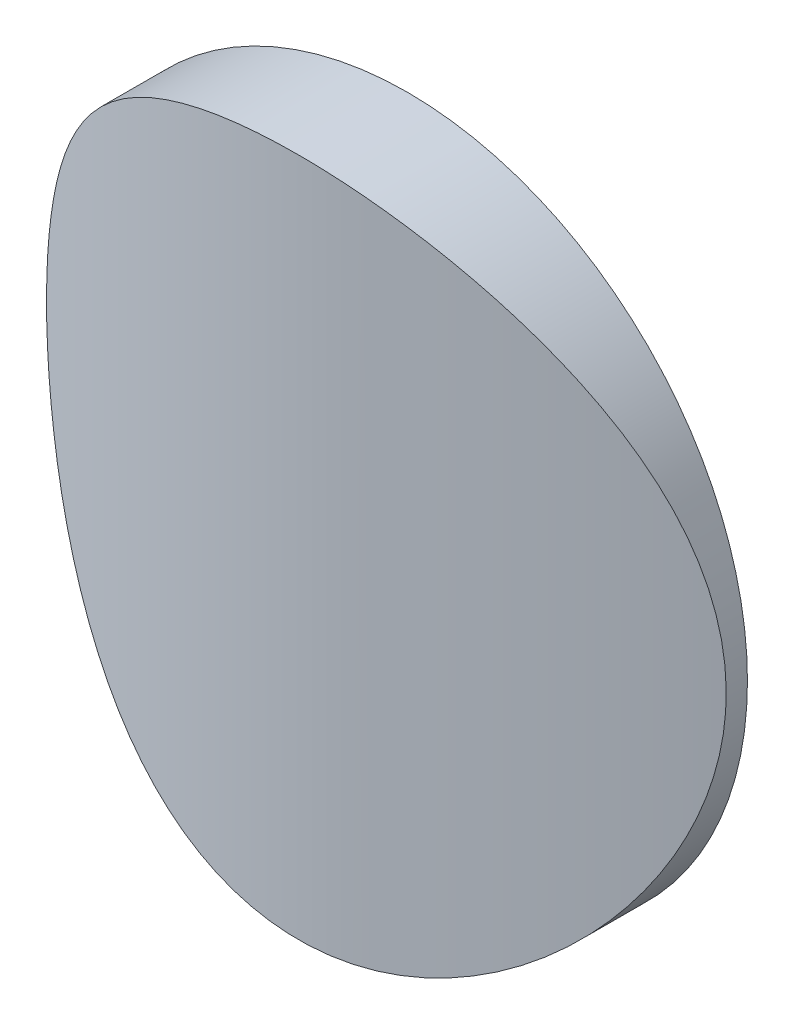
ISO-10303-21;
HEADER;
FILE_DESCRIPTION(('STEP AP214'),'2;1');
FILE_NAME('part.step','',(''),(''),'','','');
FILE_SCHEMA(('AUTOMOTIVE_DESIGN { 1 0 10303 214 1 1 1 1 }'));
ENDSEC;
DATA;
#1=APPLICATION_CONTEXT('core data for automotive mechanical design processes');
#2=APPLICATION_PROTOCOL_DEFINITION('international standard','automotive_design',2000,#1);
#3=PRODUCT_CONTEXT('',#1,'mechanical');
#4=PRODUCT('Part','Part','',(#3));
#5=PRODUCT_RELATED_PRODUCT_CATEGORY('part','',(#4));
#6=PRODUCT_DEFINITION_FORMATION('','',#4);
#7=PRODUCT_DEFINITION_CONTEXT('part definition',#1,'design');
#8=PRODUCT_DEFINITION('design','',#6,#7);
#9=PRODUCT_DEFINITION_SHAPE('','',#8);
#10=(LENGTH_UNIT() NAMED_UNIT(*) SI_UNIT(.MILLI.,.METRE.));
#11=(NAMED_UNIT(*) PLANE_ANGLE_UNIT() SI_UNIT($,.RADIAN.));
#12=(NAMED_UNIT(*) SI_UNIT($,.STERADIAN.) SOLID_ANGLE_UNIT());
#13=UNCERTAINTY_MEASURE_WITH_UNIT(LENGTH_MEASURE(1.E-05),#10,'distance_accuracy_value','');
#14=(GEOMETRIC_REPRESENTATION_CONTEXT(3) GLOBAL_UNCERTAINTY_ASSIGNED_CONTEXT((#13)) GLOBAL_UNIT_ASSIGNED_CONTEXT((#10,
#11,#12)) REPRESENTATION_CONTEXT('',''));
#15=CARTESIAN_POINT('',(0.,0.,0.));
#16=DIRECTION('',(0.,0.,1.));
#17=DIRECTION('',(1.,0.,0.));
#18=AXIS2_PLACEMENT_3D('',#15,#16,#17);
#19=CARTESIAN_POINT('',(0.,0.,25.4));
#20=DIRECTION('',(0.,0.,-1.));
#21=DIRECTION('',(-1.,0.,0.));
#22=AXIS2_PLACEMENT_3D('',#19,#20,#21);
#23=CYLINDRICAL_SURFACE('',#22,25.4);
#24=CARTESIAN_POINT('',(0.,0.,0.));
#25=DIRECTION('',(0.,0.,1.));
#26=DIRECTION('',(1.,0.,0.));
#27=AXIS2_PLACEMENT_3D('',#24,#25,#26);
#28=CIRCLE('',#27,25.4);
#29=CARTESIAN_POINT('',(25.4,0.,0.));
#30=VERTEX_POINT('',#29);
#31=EDGE_CURVE('E44',#30,#30,#28,.T.);
#32=ORIENTED_EDGE('',*,*,#31,.T.);
#33=EDGE_LOOP('',(#32));
#34=FACE_BOUND('',#33,.T.);
#35=CARTESIAN_POINT('',(0.,25.4,8.12799999999999));
#36=CARTESIAN_POINT('',(-0.671047739566084,25.3999946839773,8.12799554394134));
#37=CARTESIAN_POINT('',(-1.34220901790629,25.3733734244155,8.11512092197818));
#38=CARTESIAN_POINT('',(-2.67943447114101,25.2671872334301,8.0639479726841));
#39=CARTESIAN_POINT('',(-3.34549745538565,25.1876102947373,8.02564387943226));
#40=CARTESIAN_POINT('',(-4.66807147790157,24.9763480149225,7.9245685632981));
#41=CARTESIAN_POINT('',(-5.32457283014787,24.8446131919455,7.86177410741228));
#42=CARTESIAN_POINT('',(-6.62264448081759,24.5305222359281,7.71333457651723));
#43=CARTESIAN_POINT('',(-7.26421548473276,24.348168500028,7.62769058359216));
#44=CARTESIAN_POINT('',(-8.52604432813423,23.9354488057154,7.43601479274481));
#45=CARTESIAN_POINT('',(-9.14636827209947,23.7052512740393,7.33005461360621));
#46=CARTESIAN_POINT('',(-10.3643366325277,23.1986120436619,7.10008005255402));
#47=CARTESIAN_POINT('',(-10.9619808485634,22.9221699364009,6.97606551113574));
#48=CARTESIAN_POINT('',(-12.131377710036,22.3253359670934,6.71282826642974));
#49=CARTESIAN_POINT('',(-12.7031303343891,22.0049440692593,6.57360555075825));
#50=CARTESIAN_POINT('',(-13.8179822820437,21.3225366513007,6.28304003856609));
#51=CARTESIAN_POINT('',(-14.3610805300561,20.9605195707611,6.13169678774403));
#52=CARTESIAN_POINT('',(-15.446533670218,20.1752013560551,5.81120811893723));
#53=CARTESIAN_POINT('',(-15.9870513785544,19.7495736741808,5.64153946242849));
#54=CARTESIAN_POINT('',(-17.0307682860765,18.85694889128,5.29636877185941));
#55=CARTESIAN_POINT('',(-17.5339662756762,18.3899504504432,5.1208665489915));
#56=CARTESIAN_POINT('',(-18.5008613615014,17.416909188769,4.76817906443331));
#57=CARTESIAN_POINT('',(-18.9645429860009,16.9108512215039,4.5909931734455));
#58=CARTESIAN_POINT('',(-19.8500890807332,15.8620695769265,4.23929217158282));
#59=CARTESIAN_POINT('',(-20.2719330287104,15.3193281229312,4.06477840658489));
#60=CARTESIAN_POINT('',(-21.0997532266227,14.1599184157278,3.71080732501621));
#61=CARTESIAN_POINT('',(-21.5024502360738,13.5407384648689,3.53188558592503));
#62=CARTESIAN_POINT('',(-22.2536785881809,12.2670353732077,3.18812030349));
#63=CARTESIAN_POINT('',(-22.6022368116684,11.6125299910198,3.02326979197509));
#64=CARTESIAN_POINT('',(-23.2422277005098,10.2718268343628,2.71324224121944));
#65=CARTESIAN_POINT('',(-23.533673979063,9.58563666058023,2.56806051628084));
#66=CARTESIAN_POINT('',(-24.0563395475927,8.18598714163273,2.30280355428646));
#67=CARTESIAN_POINT('',(-24.2875650520068,7.47253061891861,2.18272572690526));
#68=CARTESIAN_POINT('',(-24.6752445511957,6.06575460867585,1.97869365445364));
#69=CARTESIAN_POINT('',(-24.8352522280282,5.37366043154565,1.89305060112691));
#70=CARTESIAN_POINT('',(-25.0970351452683,3.97549341683741,1.75180886565517));
#71=CARTESIAN_POINT('',(-25.1988127226589,3.26942114142749,1.69620897777505));
#72=CARTESIAN_POINT('',(-25.3425778465285,1.84993815561596,1.61741352602194));
#73=CARTESIAN_POINT('',(-25.3846100751235,1.13653333168281,1.59419374608783));
#74=CARTESIAN_POINT('',(-25.408362046879,-0.291558164844992,1.58109240229235));
#75=CARTESIAN_POINT('',(-25.3900868916496,-1.00624472390151,1.59120801847453));
#76=CARTESIAN_POINT('',(-25.2988549054173,-2.35192303249062,1.64138991839888));
#77=CARTESIAN_POINT('',(-25.2321308821985,-2.98347764284838,1.67804104181327));
#78=CARTESIAN_POINT('',(-25.051981739992,-4.23788080334826,1.77612699524107));
#79=CARTESIAN_POINT('',(-24.9385606258442,-4.86073009534152,1.83755969992533));
#80=CARTESIAN_POINT('',(-24.666261287338,-6.09379604715036,1.98323612783257));
#81=CARTESIAN_POINT('',(-24.5073731108967,-6.70400990986045,2.06748484493436));
#82=CARTESIAN_POINT('',(-24.1457521534273,-7.90808788680017,2.25621245369962));
#83=CARTESIAN_POINT('',(-23.9430171696014,-8.50195117791123,2.36069236172019));
#84=CARTESIAN_POINT('',(-23.4903536503083,-9.68363489337588,2.58950582566472));
#85=CARTESIAN_POINT('',(-23.2394468967744,-10.2710021664969,2.71424075085866));
#86=CARTESIAN_POINT('',(-22.6955200386508,-11.4227483795134,2.97837602569645));
#87=CARTESIAN_POINT('',(-22.4024820911272,-11.987117448835,3.11778258216838));
#88=CARTESIAN_POINT('',(-21.7763170730276,-13.0902369655399,3.40767544873305));
#89=CARTESIAN_POINT('',(-21.4431858824623,-13.6289847721277,3.55816289688243));
#90=CARTESIAN_POINT('',(-20.738756599552,-14.6786772375228,3.86664213512303));
#91=CARTESIAN_POINT('',(-20.3674556444023,-15.1896198064828,4.02463448761755));
#92=CARTESIAN_POINT('',(-19.5428146692517,-16.2399170658602,4.36337650837182));
#93=CARTESIAN_POINT('',(-19.0849602704888,-16.775574904491,4.54462184312655));
#94=CARTESIAN_POINT('',(-18.1263784379755,-17.8070258006577,4.90730039291288));
#95=CARTESIAN_POINT('',(-17.6256478603984,-18.3028159297811,5.08873362075619));
#96=CARTESIAN_POINT('',(-16.5835179889461,-19.2521167959421,5.44726241662059));
#97=CARTESIAN_POINT('',(-16.042093594888,-19.7056010455633,5.62435521665543));
#98=CARTESIAN_POINT('',(-14.9215455613907,-20.5671322885457,5.96961169778342));
#99=CARTESIAN_POINT('',(-14.3424223735546,-20.9751798260459,6.1377754857956));
#100=CARTESIAN_POINT('',(-13.1247761712034,-21.7588096603912,6.46758389568415));
#101=CARTESIAN_POINT('',(-12.4847876457142,-22.1323545518983,6.62867225925027));
#102=CARTESIAN_POINT('',(-11.1709577651139,-22.8236874118615,6.93200334382781));
#103=CARTESIAN_POINT('',(-10.4971126192614,-23.1414691188426,7.07424394804424));
#104=CARTESIAN_POINT('',(-9.12140980723828,-23.7173996176435,7.33547444822771));
#105=CARTESIAN_POINT('',(-8.41960122504591,-23.9756479300442,7.45450309498827));
#106=CARTESIAN_POINT('',(-6.99240900634411,-24.430032944931,7.66594814930901));
#107=CARTESIAN_POINT('',(-6.26703475961679,-24.6261940594546,7.75837501511223));
#108=CARTESIAN_POINT('',(-5.08096434234856,-24.8909345257469,7.88389905553348));
#109=CARTESIAN_POINT('',(-4.62560297676387,-24.979579320313,7.92614952101317));
#110=CARTESIAN_POINT('',(-3.70971731050397,-25.1319207140468,7.99897519479619));
#111=CARTESIAN_POINT('',(-3.24919254152993,-25.195615031174,8.02954933514367));
#112=CARTESIAN_POINT('',(-2.32472408543728,-25.2976662391055,8.07862077304784));
#113=CARTESIAN_POINT('',(-1.86078055072625,-25.3360242525677,8.09711860570828));
#114=CARTESIAN_POINT('',(-0.931242759968339,-25.3871913968806,8.12180900398663));
#115=CARTESIAN_POINT('',(-0.465648715305776,-25.400003688857,8.12800309211679));
#116=CARTESIAN_POINT('',(0.671047739566084,-25.3999946839773,8.12799554394133));
#117=CARTESIAN_POINT('',(1.34220901790629,-25.3733734244155,8.11512092197818));
#118=CARTESIAN_POINT('',(2.67943447114101,-25.2671872334301,8.06394797268411));
#119=CARTESIAN_POINT('',(3.34549745538566,-25.1876102947373,8.02564387943227));
#120=CARTESIAN_POINT('',(4.66807147790158,-24.9763480149225,7.9245685632981));
#121=CARTESIAN_POINT('',(5.32457283014788,-24.8446131919455,7.86177410741228));
#122=CARTESIAN_POINT('',(6.62264448081759,-24.5305222359281,7.71333457651724));
#123=CARTESIAN_POINT('',(7.26421548473276,-24.348168500028,7.62769058359216));
#124=CARTESIAN_POINT('',(8.52604432813423,-23.9354488057154,7.43601479274481));
#125=CARTESIAN_POINT('',(9.14636827209947,-23.7052512740393,7.3300546136062));
#126=CARTESIAN_POINT('',(10.3643366325276,-23.1986120436619,7.10008005255403));
#127=CARTESIAN_POINT('',(10.9619808485634,-22.9221699364009,6.97606551113574));
#128=CARTESIAN_POINT('',(12.131377710036,-22.3253359670934,6.71282826642974));
#129=CARTESIAN_POINT('',(12.7031303343891,-22.0049440692593,6.57360555075825));
#130=CARTESIAN_POINT('',(13.8179822820436,-21.3225366513007,6.28304003856609));
#131=CARTESIAN_POINT('',(14.3610805300561,-20.9605195707611,6.13169678774403));
#132=CARTESIAN_POINT('',(15.446533670218,-20.1752013560551,5.81120811893723));
#133=CARTESIAN_POINT('',(15.9870513785544,-19.7495736741808,5.64153946242849));
#134=CARTESIAN_POINT('',(17.0307682860765,-18.85694889128,5.29636877185941));
#135=CARTESIAN_POINT('',(17.5339662756762,-18.3899504504432,5.1208665489915));
#136=CARTESIAN_POINT('',(18.5008613615014,-17.416909188769,4.76817906443331));
#137=CARTESIAN_POINT('',(18.9645429860009,-16.9108512215039,4.5909931734455));
#138=CARTESIAN_POINT('',(19.8500890807332,-15.8620695769265,4.23929217158282));
#139=CARTESIAN_POINT('',(20.2719330287104,-15.3193281229312,4.06477840658489));
#140=CARTESIAN_POINT('',(21.0997532266227,-14.1599184157278,3.71080732501621));
#141=CARTESIAN_POINT('',(21.5024502360738,-13.5407384648689,3.53188558592503));
#142=CARTESIAN_POINT('',(22.2536785881809,-12.2670353732077,3.18812030349));
#143=CARTESIAN_POINT('',(22.6022368116684,-11.6125299910198,3.02326979197509));
#144=CARTESIAN_POINT('',(23.2422277005098,-10.2718268343628,2.71324224121944));
#145=CARTESIAN_POINT('',(23.533673979063,-9.58563666058023,2.56806051628084));
#146=CARTESIAN_POINT('',(24.0563395475927,-8.18598714163273,2.30280355428646));
#147=CARTESIAN_POINT('',(24.2875650520068,-7.47253061891861,2.18272572690526));
#148=CARTESIAN_POINT('',(24.6752445511957,-6.06575460867585,1.97869365445364));
#149=CARTESIAN_POINT('',(24.8352522280282,-5.37366043154564,1.89305060112691));
#150=CARTESIAN_POINT('',(25.0970351452683,-3.97549341683741,1.75180886565517));
#151=CARTESIAN_POINT('',(25.1988127226589,-3.26942114142748,1.69620897777505));
#152=CARTESIAN_POINT('',(25.3425778465285,-1.84993815561596,1.61741352602194));
#153=CARTESIAN_POINT('',(25.3846100751235,-1.13653333168281,1.59419374608783));
#154=CARTESIAN_POINT('',(25.408362046879,0.29155816484499,1.58109240229234));
#155=CARTESIAN_POINT('',(25.3900868916496,1.00624472390151,1.59120801847453));
#156=CARTESIAN_POINT('',(25.2988549054173,2.35192303249062,1.64138991839888));
#157=CARTESIAN_POINT('',(25.2321308821985,2.98347764284838,1.67804104181327));
#158=CARTESIAN_POINT('',(25.051981739992,4.23788080334826,1.77612699524107));
#159=CARTESIAN_POINT('',(24.9385606258442,4.86073009534151,1.83755969992533));
#160=CARTESIAN_POINT('',(24.666261287338,6.09379604715035,1.98323612783257));
#161=CARTESIAN_POINT('',(24.5073731108967,6.70400990986044,2.06748484493435));
#162=CARTESIAN_POINT('',(24.1457521534273,7.90808788680017,2.25621245369961));
#163=CARTESIAN_POINT('',(23.9430171696014,8.50195117791123,2.36069236172019));
#164=CARTESIAN_POINT('',(23.4903536503083,9.68363489337589,2.58950582566472));
#165=CARTESIAN_POINT('',(23.2394468967744,10.2710021664969,2.71424075085866));
#166=CARTESIAN_POINT('',(22.6955200386508,11.4227483795134,2.97837602569645));
#167=CARTESIAN_POINT('',(22.4024820911272,11.987117448835,3.11778258216838));
#168=CARTESIAN_POINT('',(21.7763170730276,13.0902369655399,3.40767544873305));
#169=CARTESIAN_POINT('',(21.4431858824623,13.6289847721277,3.55816289688245));
#170=CARTESIAN_POINT('',(20.738756599552,14.6786772375228,3.86664213512304));
#171=CARTESIAN_POINT('',(20.3674556444023,15.1896198064828,4.02463448761755));
#172=CARTESIAN_POINT('',(19.5428146692517,16.2399170658602,4.36337650837182));
#173=CARTESIAN_POINT('',(19.0849602704888,16.775574904491,4.54462184312655));
#174=CARTESIAN_POINT('',(18.1263784379755,17.8070258006577,4.90730039291288));
#175=CARTESIAN_POINT('',(17.6256478603984,18.3028159297811,5.08873362075619));
#176=CARTESIAN_POINT('',(16.5835179889461,19.2521167959421,5.44726241662059));
#177=CARTESIAN_POINT('',(16.042093594888,19.7056010455633,5.62435521665543));
#178=CARTESIAN_POINT('',(14.9215455613907,20.5671322885457,5.96961169778342));
#179=CARTESIAN_POINT('',(14.3424223735546,20.9751798260459,6.1377754857956));
#180=CARTESIAN_POINT('',(13.1247761712034,21.7588096603912,6.46758389568415));
#181=CARTESIAN_POINT('',(12.4847876457142,22.1323545518983,6.62867225925027));
#182=CARTESIAN_POINT('',(11.1709577651139,22.8236874118615,6.93200334382781));
#183=CARTESIAN_POINT('',(10.4971126192615,23.1414691188426,7.07424394804424));
#184=CARTESIAN_POINT('',(9.1214098072383,23.7173996176435,7.33547444822772));
#185=CARTESIAN_POINT('',(8.41960122504593,23.9756479300442,7.45450309498827));
#186=CARTESIAN_POINT('',(6.99240900634413,24.430032944931,7.66594814930901));
#187=CARTESIAN_POINT('',(6.2670347596168,24.6261940594546,7.75837501511223));
#188=CARTESIAN_POINT('',(5.08096434234856,24.8909345257469,7.88389905553348));
#189=CARTESIAN_POINT('',(4.62560297676389,24.979579320313,7.92614952101317));
#190=CARTESIAN_POINT('',(3.70971731050399,25.1319207140468,7.99897519479618));
#191=CARTESIAN_POINT('',(3.24919254152996,25.195615031174,8.02954933514367));
#192=CARTESIAN_POINT('',(2.3247240854373,25.2976662391055,8.07862077304783));
#193=CARTESIAN_POINT('',(1.86078055072627,25.3360242525677,8.09711860570828));
#194=CARTESIAN_POINT('',(0.931242759968354,25.3871913968806,8.12180900398662));
#195=CARTESIAN_POINT('',(0.465648715305784,25.400003688857,8.12800309211679));
#196=CARTESIAN_POINT('',(0.,25.4,8.12799999999999));
#197=B_SPLINE_CURVE_WITH_KNOTS('',3,(#35,#36,#37,#38,#39,#40,#41,#42,#43,#44,#45,#46,#47,#48,
#49,#50,#51,#52,#53,#54,#55,#56,#57,#58,#59,#60,#61,#62,#63,#64,#65,#66,#67,#68,#69,#70,#71,#72,
#73,#74,#75,#76,#77,#78,#79,#80,#81,#82,#83,#84,#85,#86,#87,#88,#89,#90,#91,#92,#93,#94,#95,#96,
#97,#98,#99,#100,#101,#102,#103,#104,#105,#106,#107,#108,#109,#110,#111,#112,#113,#114,#115,
#116,#117,#118,#119,#120,#121,#122,#123,#124,#125,#126,#127,#128,#129,#130,#131,#132,#133,#134,
#135,#136,#137,#138,#139,#140,#141,#142,#143,#144,#145,#146,#147,#148,#149,#150,#151,#152,#153,
#154,#155,#156,#157,#158,#159,#160,#161,#162,#163,#164,#165,#166,#167,#168,#169,#170,#171,#172,
#173,#174,#175,#176,#177,#178,#179,#180,#181,#182,#183,#184,#185,#186,#187,#188,#189,#190,#191,
#192,#193,#194,#195,#196),.UNSPECIFIED.,.T.,.F.,(4,2,2,2,2,2,2,2,2,2,2,2,2,2,2,2,2,2,2,2,2,2,2,
2,2,2,2,2,2,2,2,2,2,2,2,2,2,2,2,2,2,2,2,2,2,2,2,2,2,2,2,2,2,2,2,2,2,2,2,2,2,2,2,2,2,2,2,2,2,2,2,
2,2,2,2,2,2,2,2,2,4),(0.,2.01269292756957,4.02584237244123,6.04090627337123,8.05587476397411,
10.0638665000264,12.0718759771419,14.0798870893599,16.0879735010237,18.2114874544815,
20.3350702040422,22.4594806101038,24.5849279828169,26.8620133830071,29.1379645320843,
31.4133725239591,33.6885456136897,35.8320063584228,37.9753810723459,40.1171519627143,
42.2587416779274,44.1648771343797,46.0708491507271,47.9772386763435,49.8837239983684,
51.8340591466366,53.785222725585,55.7365869779389,57.6880976932377,59.8685075270818,
62.0490773730854,64.2310034227767,66.412903339447,68.684935120146,70.9572218572208,
73.2256820659565,75.4932492286248,76.8899899483629,78.2868583881128,79.6836649281233,
81.080298611196,83.0929915387656,85.1061409836372,87.1212048845672,89.1361733751701,
91.1441651112224,93.1521745883378,95.1601857005559,97.1682721122197,99.2917860656774,
101.415368815238,103.5397792213,105.665226594013,107.942311994203,110.21826314328,
112.493671135155,114.768844224886,116.912304969619,119.055679683542,121.19745057391,
123.339040289123,125.245175745576,127.151147761923,129.05753728754,130.964022609564,
132.914357757833,134.865521336781,136.816885589135,138.768396304434,140.948806138278,
143.129375984281,145.311302033973,147.493201950643,149.765233731342,152.037520468417,
154.305980677152,156.573547839821,157.970288559559,159.367156999309,160.763963539319,
162.160597222392),.UNSPECIFIED.);
#198=CARTESIAN_POINT('',(0.,25.4,8.12799999999999));
#199=VERTEX_POINT('',#198);
#200=EDGE_CURVE('E11',#199,#199,#197,.T.);
#201=ORIENTED_EDGE('',*,*,#200,.F.);
#202=EDGE_LOOP('',(#201));
#203=FACE_BOUND('',#202,.T.);
#204=ADVANCED_FACE('F34',(#34,#203),#23,.T.);
#205=CARTESIAN_POINT('',(0.,0.,0.));
#206=DIRECTION('',(0.,0.,1.));
#207=DIRECTION('',(1.,0.,0.));
#208=AXIS2_PLACEMENT_3D('',#205,#206,#207);
#209=PLANE('',#208);
#210=ORIENTED_EDGE('',*,*,#31,.F.);
#211=EDGE_LOOP('',(#210));
#212=FACE_BOUND('',#211,.T.);
#213=ADVANCED_FACE('F52',(#212),#209,.F.);
#214=CARTESIAN_POINT('',(0.,-25.4,-44.45));
#215=DIRECTION('',(0.,1.,0.));
#216=DIRECTION('',(0.,0.,1.));
#217=AXIS2_PLACEMENT_3D('',#214,#215,#216);
#218=CYLINDRICAL_SURFACE('',#217,52.578);
#219=ORIENTED_EDGE('',*,*,#200,.T.);
#220=EDGE_LOOP('',(#219));
#221=FACE_BOUND('',#220,.T.);
#222=ADVANCED_FACE('F54',(#221),#218,.T.);
#223=CLOSED_SHELL('',(#204,#213,#222));
#224=MANIFOLD_SOLID_BREP('B2',#223);
#225=ADVANCED_BREP_SHAPE_REPRESENTATION('',(#18,#224),#14);
#226=SHAPE_DEFINITION_REPRESENTATION(#9,#225);
ENDSEC;
END-ISO-10303-21;
